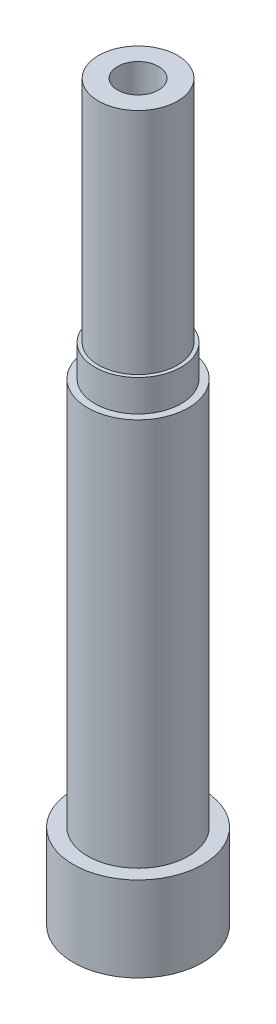
ISO-10303-21;
HEADER;
FILE_DESCRIPTION(('STEP AP214'),'2;1');
FILE_NAME('part.step','',(''),(''),'','','');
FILE_SCHEMA(('AUTOMOTIVE_DESIGN { 1 0 10303 214 1 1 1 1 }'));
ENDSEC;
DATA;
#1=APPLICATION_CONTEXT('core data for automotive mechanical design processes');
#2=APPLICATION_PROTOCOL_DEFINITION('international standard','automotive_design',2000,#1);
#3=PRODUCT_CONTEXT('',#1,'mechanical');
#4=PRODUCT('Part','Part','',(#3));
#5=PRODUCT_RELATED_PRODUCT_CATEGORY('part','',(#4));
#6=PRODUCT_DEFINITION_FORMATION('','',#4);
#7=PRODUCT_DEFINITION_CONTEXT('part definition',#1,'design');
#8=PRODUCT_DEFINITION('design','',#6,#7);
#9=PRODUCT_DEFINITION_SHAPE('','',#8);
#10=(LENGTH_UNIT() NAMED_UNIT(*) SI_UNIT(.MILLI.,.METRE.));
#11=(NAMED_UNIT(*) PLANE_ANGLE_UNIT() SI_UNIT($,.RADIAN.));
#12=(NAMED_UNIT(*) SI_UNIT($,.STERADIAN.) SOLID_ANGLE_UNIT());
#13=UNCERTAINTY_MEASURE_WITH_UNIT(LENGTH_MEASURE(1.E-05),#10,'distance_accuracy_value','');
#14=(GEOMETRIC_REPRESENTATION_CONTEXT(3) GLOBAL_UNCERTAINTY_ASSIGNED_CONTEXT((#13)) GLOBAL_UNIT_ASSIGNED_CONTEXT((#10,
#11,#12)) REPRESENTATION_CONTEXT('',''));
#15=CARTESIAN_POINT('',(0.,0.,0.));
#16=DIRECTION('',(0.,0.,1.));
#17=DIRECTION('',(1.,0.,0.));
#18=AXIS2_PLACEMENT_3D('',#15,#16,#17);
#19=CARTESIAN_POINT('',(0.,510.,0.));
#20=DIRECTION('',(0.,-1.,0.));
#21=DIRECTION('',(0.,0.,-1.));
#22=AXIS2_PLACEMENT_3D('',#19,#20,#21);
#23=CYLINDRICAL_SURFACE('',#22,14.);
#24=CARTESIAN_POINT('',(0.,79.4,0.));
#25=DIRECTION('',(0.,-1.,0.));
#26=DIRECTION('',(0.,0.,-1.));
#27=AXIS2_PLACEMENT_3D('',#24,#25,#26);
#28=CIRCLE('',#27,14.);
#29=CARTESIAN_POINT('',(0.,79.4,-14.));
#30=VERTEX_POINT('',#29);
#31=EDGE_CURVE('E29',#30,#30,#28,.T.);
#32=ORIENTED_EDGE('',*,*,#31,.T.);
#33=EDGE_LOOP('',(#32));
#34=FACE_BOUND('',#33,.T.);
#35=CARTESIAN_POINT('',(0.,115.1,0.));
#36=DIRECTION('',(0.,-1.,0.));
#37=DIRECTION('',(0.,0.,-1.));
#38=AXIS2_PLACEMENT_3D('',#35,#36,#37);
#39=CIRCLE('',#38,14.);
#40=CARTESIAN_POINT('',(0.,115.1,-14.));
#41=VERTEX_POINT('',#40);
#42=EDGE_CURVE('E71',#41,#41,#39,.F.);
#43=ORIENTED_EDGE('',*,*,#42,.T.);
#44=EDGE_LOOP('',(#43));
#45=FACE_BOUND('',#44,.T.);
#46=ADVANCED_FACE('F14',(#34,#45),#23,.F.);
#47=CARTESIAN_POINT('',(0.,78.4,0.));
#48=DIRECTION('',(0.,-1.,0.));
#49=DIRECTION('',(1.,0.,0.));
#50=AXIS2_PLACEMENT_3D('',#47,#48,#49);
#51=CONICAL_SURFACE('',#50,15.,0.785398163397455);
#52=ORIENTED_EDGE('',*,*,#31,.F.);
#53=EDGE_LOOP('',(#52));
#54=FACE_BOUND('',#53,.T.);
#55=CARTESIAN_POINT('',(0.,78.4,0.));
#56=DIRECTION('',(0.,-1.,0.));
#57=DIRECTION('',(1.,0.,0.));
#58=AXIS2_PLACEMENT_3D('',#55,#56,#57);
#59=CIRCLE('',#58,15.);
#60=CARTESIAN_POINT('',(15.,78.4,0.));
#61=VERTEX_POINT('',#60);
#62=EDGE_CURVE('E17',#61,#61,#59,.F.);
#63=ORIENTED_EDGE('',*,*,#62,.F.);
#64=EDGE_LOOP('',(#63));
#65=FACE_BOUND('',#64,.T.);
#66=ADVANCED_FACE('F80',(#54,#65),#51,.F.);
#67=CARTESIAN_POINT('',(0.,115.1,0.));
#68=DIRECTION('',(0.,-1.,0.));
#69=DIRECTION('',(0.,0.,-1.));
#70=AXIS2_PLACEMENT_3D('',#67,#68,#69);
#71=CONICAL_SURFACE('',#70,14.,0.785398163397441);
#72=ORIENTED_EDGE('',*,*,#42,.F.);
#73=EDGE_LOOP('',(#72));
#74=FACE_BOUND('',#73,.T.);
#75=CARTESIAN_POINT('',(0.,115.9,0.));
#76=DIRECTION('',(0.,1.,0.));
#77=DIRECTION('',(0.,0.,1.));
#78=AXIS2_PLACEMENT_3D('',#75,#76,#77);
#79=CIRCLE('',#78,13.2);
#80=CARTESIAN_POINT('',(0.,115.9,13.2));
#81=VERTEX_POINT('',#80);
#82=EDGE_CURVE('E60',#81,#81,#79,.T.);
#83=ORIENTED_EDGE('',*,*,#82,.T.);
#84=EDGE_LOOP('',(#83));
#85=FACE_BOUND('',#84,.T.);
#86=ADVANCED_FACE('F83',(#74,#85),#71,.F.);
#87=CARTESIAN_POINT('',(0.,78.4,0.));
#88=DIRECTION('',(0.,-1.,0.));
#89=DIRECTION('',(0.,0.,-1.));
#90=AXIS2_PLACEMENT_3D('',#87,#88,#89);
#91=PLANE('',#90);
#92=CARTESIAN_POINT('',(0.,78.4,0.));
#93=DIRECTION('',(0.,1.,0.));
#94=DIRECTION('',(0.,0.,1.));
#95=AXIS2_PLACEMENT_3D('',#92,#93,#94);
#96=CIRCLE('',#95,17.5);
#97=CARTESIAN_POINT('',(0.,78.4,17.5));
#98=VERTEX_POINT('',#97);
#99=EDGE_CURVE('E57',#98,#98,#96,.F.);
#100=ORIENTED_EDGE('',*,*,#99,.T.);
#101=EDGE_LOOP('',(#100));
#102=FACE_BOUND('',#101,.T.);
#103=ORIENTED_EDGE('',*,*,#62,.T.);
#104=EDGE_LOOP('',(#103));
#105=FACE_BOUND('',#104,.T.);
#106=ADVANCED_FACE('F86',(#102,#105),#91,.T.);
#107=CARTESIAN_POINT('',(0.,115.9,0.));
#108=DIRECTION('',(0.,1.,0.));
#109=DIRECTION('',(0.,0.,1.));
#110=AXIS2_PLACEMENT_3D('',#107,#108,#109);
#111=CYLINDRICAL_SURFACE('',#110,13.2);
#112=CARTESIAN_POINT('',(0.,120.4,0.));
#113=DIRECTION('',(0.,1.,0.));
#114=DIRECTION('',(0.,0.,1.));
#115=AXIS2_PLACEMENT_3D('',#112,#113,#114);
#116=CIRCLE('',#115,13.2);
#117=CARTESIAN_POINT('',(0.,120.4,13.2));
#118=VERTEX_POINT('',#117);
#119=EDGE_CURVE('E59',#118,#118,#116,.T.);
#120=ORIENTED_EDGE('',*,*,#119,.T.);
#121=EDGE_LOOP('',(#120));
#122=FACE_BOUND('',#121,.T.);
#123=ORIENTED_EDGE('',*,*,#82,.F.);
#124=EDGE_LOOP('',(#123));
#125=FACE_BOUND('',#124,.T.);
#126=ADVANCED_FACE('F88',(#122,#125),#111,.F.);
#127=CARTESIAN_POINT('',(0.,68.4,0.));
#128=DIRECTION('',(0.,1.,0.));
#129=DIRECTION('',(0.,0.,1.));
#130=AXIS2_PLACEMENT_3D('',#127,#128,#129);
#131=CYLINDRICAL_SURFACE('',#130,17.5);
#132=ORIENTED_EDGE('',*,*,#99,.F.);
#133=EDGE_LOOP('',(#132));
#134=FACE_BOUND('',#133,.T.);
#135=CARTESIAN_POINT('',(0.,68.4,0.));
#136=DIRECTION('',(0.,1.,0.));
#137=DIRECTION('',(0.,0.,1.));
#138=AXIS2_PLACEMENT_3D('',#135,#136,#137);
#139=CIRCLE('',#138,17.5);
#140=CARTESIAN_POINT('',(0.,68.4,17.5));
#141=VERTEX_POINT('',#140);
#142=EDGE_CURVE('E64',#141,#141,#139,.F.);
#143=ORIENTED_EDGE('',*,*,#142,.T.);
#144=EDGE_LOOP('',(#143));
#145=FACE_BOUND('',#144,.T.);
#146=ADVANCED_FACE('F96',(#134,#145),#131,.F.);
#147=CARTESIAN_POINT('',(0.,121.45,0.));
#148=DIRECTION('',(0.,1.,0.));
#149=DIRECTION('',(-1.,0.,0.));
#150=AXIS2_PLACEMENT_3D('',#147,#148,#149);
#151=CONICAL_SURFACE('',#150,14.25,0.785398163397476);
#152=CARTESIAN_POINT('',(0.,121.45,0.));
#153=DIRECTION('',(0.,-1.,0.));
#154=DIRECTION('',(0.,0.,-1.));
#155=AXIS2_PLACEMENT_3D('',#152,#153,#154);
#156=CIRCLE('',#155,14.25);
#157=CARTESIAN_POINT('',(0.,121.45,-14.25));
#158=VERTEX_POINT('',#157);
#159=EDGE_CURVE('E173',#158,#158,#156,.F.);
#160=ORIENTED_EDGE('',*,*,#159,.T.);
#161=EDGE_LOOP('',(#160));
#162=FACE_BOUND('',#161,.T.);
#163=ORIENTED_EDGE('',*,*,#119,.F.);
#164=EDGE_LOOP('',(#163));
#165=FACE_BOUND('',#164,.T.);
#166=ADVANCED_FACE('F160',(#162,#165),#151,.F.);
#167=CARTESIAN_POINT('',(0.,68.4,0.));
#168=DIRECTION('',(0.,1.,0.));
#169=DIRECTION('',(0.,0.,1.));
#170=AXIS2_PLACEMENT_3D('',#167,#168,#169);
#171=CONICAL_SURFACE('',#170,17.5,0.5235987755983);
#172=ORIENTED_EDGE('',*,*,#142,.F.);
#173=EDGE_LOOP('',(#172));
#174=FACE_BOUND('',#173,.T.);
#175=CARTESIAN_POINT('',(0.,62.3378221735089,0.));
#176=DIRECTION('',(0.,-1.,0.));
#177=DIRECTION('',(0.,0.,-1.));
#178=AXIS2_PLACEMENT_3D('',#175,#176,#177);
#179=CIRCLE('',#178,14.);
#180=CARTESIAN_POINT('',(0.,62.3378221735089,-14.));
#181=VERTEX_POINT('',#180);
#182=EDGE_CURVE('E56',#181,#181,#179,.T.);
#183=ORIENTED_EDGE('',*,*,#182,.T.);
#184=EDGE_LOOP('',(#183));
#185=FACE_BOUND('',#184,.T.);
#186=ADVANCED_FACE('F156',(#174,#185),#171,.F.);
#187=CARTESIAN_POINT('',(0.,510.,0.));
#188=DIRECTION('',(0.,-1.,0.));
#189=DIRECTION('',(0.,0.,-1.));
#190=AXIS2_PLACEMENT_3D('',#187,#188,#189);
#191=CYLINDRICAL_SURFACE('',#190,14.25);
#192=ORIENTED_EDGE('',*,*,#159,.F.);
#193=EDGE_LOOP('',(#192));
#194=FACE_BOUND('',#193,.T.);
#195=CARTESIAN_POINT('',(0.,510.,0.));
#196=DIRECTION('',(0.,-1.,0.));
#197=DIRECTION('',(0.,0.,-1.));
#198=AXIS2_PLACEMENT_3D('',#195,#196,#197);
#199=CIRCLE('',#198,14.25);
#200=CARTESIAN_POINT('',(0.,510.,-14.25));
#201=VERTEX_POINT('',#200);
#202=EDGE_CURVE('E54',#201,#201,#199,.T.);
#203=ORIENTED_EDGE('',*,*,#202,.F.);
#204=EDGE_LOOP('',(#203));
#205=FACE_BOUND('',#204,.T.);
#206=ADVANCED_FACE('F152',(#194,#205),#191,.F.);
#207=CARTESIAN_POINT('',(0.,510.,0.));
#208=DIRECTION('',(0.,-1.,0.));
#209=DIRECTION('',(0.,0.,-1.));
#210=AXIS2_PLACEMENT_3D('',#207,#208,#209);
#211=CYLINDRICAL_SURFACE('',#210,14.);
#212=CARTESIAN_POINT('',(0.,56.3996206526449,0.));
#213=DIRECTION('',(0.,-1.,0.));
#214=DIRECTION('',(0.,0.,-1.));
#215=AXIS2_PLACEMENT_3D('',#212,#213,#214);
#216=CIRCLE('',#215,14.);
#217=CARTESIAN_POINT('',(0.,56.3996206526449,-14.));
#218=VERTEX_POINT('',#217);
#219=EDGE_CURVE('E53',#218,#218,#216,.T.);
#220=ORIENTED_EDGE('',*,*,#219,.T.);
#221=EDGE_LOOP('',(#220));
#222=FACE_BOUND('',#221,.T.);
#223=ORIENTED_EDGE('',*,*,#182,.F.);
#224=EDGE_LOOP('',(#223));
#225=FACE_BOUND('',#224,.T.);
#226=ADVANCED_FACE('F148',(#222,#225),#211,.F.);
#227=CARTESIAN_POINT('',(0.,510.,0.));
#228=DIRECTION('',(0.,1.,0.));
#229=DIRECTION('',(0.,0.,1.));
#230=AXIS2_PLACEMENT_3D('',#227,#228,#229);
#231=PLANE('',#230);
#232=CARTESIAN_POINT('',(0.,510.,0.));
#233=DIRECTION('',(0.,-1.,0.));
#234=DIRECTION('',(0.,0.,-1.));
#235=AXIS2_PLACEMENT_3D('',#232,#233,#234);
#236=CIRCLE('',#235,27.5);
#237=CARTESIAN_POINT('',(0.,510.,-27.5));
#238=VERTEX_POINT('',#237);
#239=EDGE_CURVE('E50',#238,#238,#236,.T.);
#240=ORIENTED_EDGE('',*,*,#239,.F.);
#241=EDGE_LOOP('',(#240));
#242=FACE_BOUND('',#241,.T.);
#243=ORIENTED_EDGE('',*,*,#202,.T.);
#244=EDGE_LOOP('',(#243));
#245=FACE_BOUND('',#244,.T.);
#246=ADVANCED_FACE('F144',(#242,#245),#231,.T.);
#247=CARTESIAN_POINT('',(0.,0.989532842461949,0.));
#248=DIRECTION('',(0.,-1.,0.));
#249=DIRECTION('',(0.,0.,-1.));
#250=AXIS2_PLACEMENT_3D('',#247,#248,#249);
#251=CONICAL_SURFACE('',#250,22.0806921565241,0.144813458696474);
#252=CARTESIAN_POINT('',(0.,0.989532842461945,0.));
#253=DIRECTION('',(0.,-1.,0.));
#254=DIRECTION('',(0.,0.,-1.));
#255=AXIS2_PLACEMENT_3D('',#252,#253,#254);
#256=CIRCLE('',#255,22.0806921565241);
#257=CARTESIAN_POINT('',(0.,0.989532842461947,-22.0806921565241));
#258=VERTEX_POINT('',#257);
#259=EDGE_CURVE('E49',#258,#258,#256,.T.);
#260=ORIENTED_EDGE('',*,*,#259,.T.);
#261=EDGE_LOOP('',(#260));
#262=FACE_BOUND('',#261,.T.);
#263=ORIENTED_EDGE('',*,*,#219,.F.);
#264=EDGE_LOOP('',(#263));
#265=FACE_BOUND('',#264,.T.);
#266=ADVANCED_FACE('F140',(#262,#265),#251,.F.);
#267=CARTESIAN_POINT('',(0.,510.,0.));
#268=DIRECTION('',(0.,-1.,0.));
#269=DIRECTION('',(0.,0.,-1.));
#270=AXIS2_PLACEMENT_3D('',#267,#268,#269);
#271=CYLINDRICAL_SURFACE('',#270,27.5);
#272=CARTESIAN_POINT('',(0.,351.,0.));
#273=DIRECTION('',(0.,-1.,0.));
#274=DIRECTION('',(0.,0.,-1.));
#275=AXIS2_PLACEMENT_3D('',#272,#273,#274);
#276=CIRCLE('',#275,27.5);
#277=CARTESIAN_POINT('',(0.,351.,-27.5));
#278=VERTEX_POINT('',#277);
#279=EDGE_CURVE('E46',#278,#278,#276,.T.);
#280=ORIENTED_EDGE('',*,*,#279,.F.);
#281=EDGE_LOOP('',(#280));
#282=FACE_BOUND('',#281,.T.);
#283=ORIENTED_EDGE('',*,*,#239,.T.);
#284=EDGE_LOOP('',(#283));
#285=FACE_BOUND('',#284,.T.);
#286=ADVANCED_FACE('F136',(#282,#285),#271,.T.);
#287=CARTESIAN_POINT('',(0.,0.,0.));
#288=DIRECTION('',(0.,-1.,0.));
#289=DIRECTION('',(0.,0.,-1.));
#290=AXIS2_PLACEMENT_3D('',#287,#288,#289);
#291=CONICAL_SURFACE('',#290,22.8620995901804,0.668412234294747);
#292=CARTESIAN_POINT('',(0.,0.,0.));
#293=DIRECTION('',(0.,-1.,0.));
#294=DIRECTION('',(0.,0.,-1.));
#295=AXIS2_PLACEMENT_3D('',#292,#293,#294);
#296=CIRCLE('',#295,22.8620995901804);
#297=CARTESIAN_POINT('',(0.,0.,-22.8620995901804));
#298=VERTEX_POINT('',#297);
#299=EDGE_CURVE('E43',#298,#298,#296,.T.);
#300=ORIENTED_EDGE('',*,*,#299,.T.);
#301=EDGE_LOOP('',(#300));
#302=FACE_BOUND('',#301,.T.);
#303=ORIENTED_EDGE('',*,*,#259,.F.);
#304=EDGE_LOOP('',(#303));
#305=FACE_BOUND('',#304,.T.);
#306=ADVANCED_FACE('F132',(#302,#305),#291,.F.);
#307=CARTESIAN_POINT('',(0.,351.,0.));
#308=DIRECTION('',(0.,1.,0.));
#309=DIRECTION('',(0.,0.,1.));
#310=AXIS2_PLACEMENT_3D('',#307,#308,#309);
#311=PLANE('',#310);
#312=ORIENTED_EDGE('',*,*,#279,.T.);
#313=EDGE_LOOP('',(#312));
#314=FACE_BOUND('',#313,.T.);
#315=CARTESIAN_POINT('',(0.,351.,0.));
#316=DIRECTION('',(0.,-1.,0.));
#317=DIRECTION('',(0.,0.,-1.));
#318=AXIS2_PLACEMENT_3D('',#315,#316,#317);
#319=CIRCLE('',#318,30.);
#320=CARTESIAN_POINT('',(0.,351.,-30.));
#321=VERTEX_POINT('',#320);
#322=EDGE_CURVE('E40',#321,#321,#319,.T.);
#323=ORIENTED_EDGE('',*,*,#322,.F.);
#324=EDGE_LOOP('',(#323));
#325=FACE_BOUND('',#324,.T.);
#326=ADVANCED_FACE('F128',(#314,#325),#311,.T.);
#327=CARTESIAN_POINT('',(0.,0.,0.));
#328=DIRECTION('',(0.,1.,0.));
#329=DIRECTION('',(0.,0.,1.));
#330=AXIS2_PLACEMENT_3D('',#327,#328,#329);
#331=PLANE('',#330);
#332=CARTESIAN_POINT('',(0.,0.,0.));
#333=DIRECTION('',(0.,-1.,0.));
#334=DIRECTION('',(0.,0.,-1.));
#335=AXIS2_PLACEMENT_3D('',#332,#333,#334);
#336=CIRCLE('',#335,45.);
#337=CARTESIAN_POINT('',(0.,0.,-45.));
#338=VERTEX_POINT('',#337);
#339=EDGE_CURVE('E37',#338,#338,#336,.F.);
#340=ORIENTED_EDGE('',*,*,#339,.F.);
#341=EDGE_LOOP('',(#340));
#342=FACE_BOUND('',#341,.T.);
#343=ORIENTED_EDGE('',*,*,#299,.F.);
#344=EDGE_LOOP('',(#343));
#345=FACE_BOUND('',#344,.T.);
#346=ADVANCED_FACE('F124',(#342,#345),#331,.F.);
#347=CARTESIAN_POINT('',(0.,351.,0.));
#348=DIRECTION('',(0.,-1.,0.));
#349=DIRECTION('',(0.,0.,-1.));
#350=AXIS2_PLACEMENT_3D('',#347,#348,#349);
#351=CYLINDRICAL_SURFACE('',#350,30.);
#352=CARTESIAN_POINT('',(0.,329.,0.));
#353=DIRECTION('',(0.,-1.,0.));
#354=DIRECTION('',(0.,0.,-1.));
#355=AXIS2_PLACEMENT_3D('',#352,#353,#354);
#356=CIRCLE('',#355,30.);
#357=CARTESIAN_POINT('',(0.,329.,-30.));
#358=VERTEX_POINT('',#357);
#359=EDGE_CURVE('E34',#358,#358,#356,.T.);
#360=ORIENTED_EDGE('',*,*,#359,.F.);
#361=EDGE_LOOP('',(#360));
#362=FACE_BOUND('',#361,.T.);
#363=ORIENTED_EDGE('',*,*,#322,.T.);
#364=EDGE_LOOP('',(#363));
#365=FACE_BOUND('',#364,.T.);
#366=ADVANCED_FACE('F120',(#362,#365),#351,.T.);
#367=CARTESIAN_POINT('',(0.,59.,0.));
#368=DIRECTION('',(0.,-1.,0.));
#369=DIRECTION('',(0.,0.,-1.));
#370=AXIS2_PLACEMENT_3D('',#367,#368,#369);
#371=CYLINDRICAL_SURFACE('',#370,45.);
#372=ORIENTED_EDGE('',*,*,#339,.T.);
#373=EDGE_LOOP('',(#372));
#374=FACE_BOUND('',#373,.T.);
#375=CARTESIAN_POINT('',(0.,59.,0.));
#376=DIRECTION('',(0.,-1.,0.));
#377=DIRECTION('',(0.,0.,-1.));
#378=AXIS2_PLACEMENT_3D('',#375,#376,#377);
#379=CIRCLE('',#378,45.);
#380=CARTESIAN_POINT('',(0.,59.,-45.));
#381=VERTEX_POINT('',#380);
#382=EDGE_CURVE('E26',#381,#381,#379,.F.);
#383=ORIENTED_EDGE('',*,*,#382,.F.);
#384=EDGE_LOOP('',(#383));
#385=FACE_BOUND('',#384,.T.);
#386=ADVANCED_FACE('F116',(#374,#385),#371,.T.);
#387=CARTESIAN_POINT('',(0.,329.,0.));
#388=DIRECTION('',(0.,1.,0.));
#389=DIRECTION('',(0.,0.,1.));
#390=AXIS2_PLACEMENT_3D('',#387,#388,#389);
#391=PLANE('',#390);
#392=ORIENTED_EDGE('',*,*,#359,.T.);
#393=EDGE_LOOP('',(#392));
#394=FACE_BOUND('',#393,.T.);
#395=CARTESIAN_POINT('',(0.,329.,0.));
#396=DIRECTION('',(0.,-1.,0.));
#397=DIRECTION('',(0.,0.,-1.));
#398=AXIS2_PLACEMENT_3D('',#395,#396,#397);
#399=CIRCLE('',#398,35.);
#400=CARTESIAN_POINT('',(0.,329.,-35.));
#401=VERTEX_POINT('',#400);
#402=EDGE_CURVE('E21',#401,#401,#399,.T.);
#403=ORIENTED_EDGE('',*,*,#402,.F.);
#404=EDGE_LOOP('',(#403));
#405=FACE_BOUND('',#404,.T.);
#406=ADVANCED_FACE('F109',(#394,#405),#391,.T.);
#407=CARTESIAN_POINT('',(0.,59.,0.));
#408=DIRECTION('',(0.,1.,0.));
#409=DIRECTION('',(0.,0.,1.));
#410=AXIS2_PLACEMENT_3D('',#407,#408,#409);
#411=PLANE('',#410);
#412=CARTESIAN_POINT('',(0.,59.,0.));
#413=DIRECTION('',(0.,-1.,0.));
#414=DIRECTION('',(0.,0.,-1.));
#415=AXIS2_PLACEMENT_3D('',#412,#413,#414);
#416=CIRCLE('',#415,35.);
#417=CARTESIAN_POINT('',(0.,59.,-35.));
#418=VERTEX_POINT('',#417);
#419=EDGE_CURVE('E10',#418,#418,#416,.F.);
#420=ORIENTED_EDGE('',*,*,#419,.F.);
#421=EDGE_LOOP('',(#420));
#422=FACE_BOUND('',#421,.T.);
#423=ORIENTED_EDGE('',*,*,#382,.T.);
#424=EDGE_LOOP('',(#423));
#425=FACE_BOUND('',#424,.T.);
#426=ADVANCED_FACE('F103',(#422,#425),#411,.T.);
#427=CARTESIAN_POINT('',(0.,329.,0.));
#428=DIRECTION('',(0.,-1.,0.));
#429=DIRECTION('',(0.,0.,-1.));
#430=AXIS2_PLACEMENT_3D('',#427,#428,#429);
#431=CYLINDRICAL_SURFACE('',#430,35.);
#432=ORIENTED_EDGE('',*,*,#419,.T.);
#433=EDGE_LOOP('',(#432));
#434=FACE_BOUND('',#433,.T.);
#435=ORIENTED_EDGE('',*,*,#402,.T.);
#436=EDGE_LOOP('',(#435));
#437=FACE_BOUND('',#436,.T.);
#438=ADVANCED_FACE('F101',(#434,#437),#431,.T.);
#439=CLOSED_SHELL('',(#46,#66,#86,#106,#126,#146,#166,#186,#206,#226,#246,#266,#286,#306,#326,
#346,#366,#386,#406,#426,#438));
#440=MANIFOLD_SOLID_BREP('B1',#439);
#441=ADVANCED_BREP_SHAPE_REPRESENTATION('',(#18,#440),#14);
#442=SHAPE_DEFINITION_REPRESENTATION(#9,#441);
ENDSEC;
END-ISO-10303-21;
